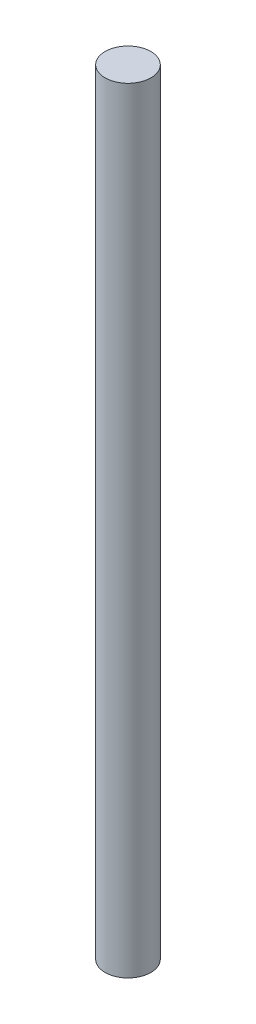
ISO-10303-21;
HEADER;
FILE_DESCRIPTION(('STEP AP214'),'2;1');
FILE_NAME('part.step','',(''),(''),'','','');
FILE_SCHEMA(('AUTOMOTIVE_DESIGN { 1 0 10303 214 1 1 1 1 }'));
ENDSEC;
DATA;
#1=APPLICATION_CONTEXT('core data for automotive mechanical design processes');
#2=APPLICATION_PROTOCOL_DEFINITION('international standard','automotive_design',2000,#1);
#3=PRODUCT_CONTEXT('',#1,'mechanical');
#4=PRODUCT('Part','Part','',(#3));
#5=PRODUCT_RELATED_PRODUCT_CATEGORY('part','',(#4));
#6=PRODUCT_DEFINITION_FORMATION('','',#4);
#7=PRODUCT_DEFINITION_CONTEXT('part definition',#1,'design');
#8=PRODUCT_DEFINITION('design','',#6,#7);
#9=PRODUCT_DEFINITION_SHAPE('','',#8);
#10=(LENGTH_UNIT() NAMED_UNIT(*) SI_UNIT(.MILLI.,.METRE.));
#11=(NAMED_UNIT(*) PLANE_ANGLE_UNIT() SI_UNIT($,.RADIAN.));
#12=(NAMED_UNIT(*) SI_UNIT($,.STERADIAN.) SOLID_ANGLE_UNIT());
#13=UNCERTAINTY_MEASURE_WITH_UNIT(LENGTH_MEASURE(1.E-05),#10,'distance_accuracy_value','');
#14=(GEOMETRIC_REPRESENTATION_CONTEXT(3) GLOBAL_UNCERTAINTY_ASSIGNED_CONTEXT((#13)) GLOBAL_UNIT_ASSIGNED_CONTEXT((#10,
#11,#12)) REPRESENTATION_CONTEXT('',''));
#15=CARTESIAN_POINT('',(0.,0.,0.));
#16=DIRECTION('',(0.,0.,1.));
#17=DIRECTION('',(1.,0.,0.));
#18=AXIS2_PLACEMENT_3D('',#15,#16,#17);
#19=CARTESIAN_POINT('',(0.,500.,0.));
#20=DIRECTION('',(0.,-1.,0.));
#21=DIRECTION('',(0.,0.,-1.));
#22=AXIS2_PLACEMENT_3D('',#19,#20,#21);
#23=CYLINDRICAL_SURFACE('',#22,14.75);
#24=CARTESIAN_POINT('',(0.,500.,0.));
#25=DIRECTION('',(0.,1.,0.));
#26=DIRECTION('',(0.,0.,1.));
#27=AXIS2_PLACEMENT_3D('',#24,#25,#26);
#28=CIRCLE('',#27,14.75);
#29=CARTESIAN_POINT('',(0.,500.,14.75));
#30=VERTEX_POINT('',#29);
#31=EDGE_CURVE('E10',#30,#30,#28,.T.);
#32=ORIENTED_EDGE('',*,*,#31,.F.);
#33=EDGE_LOOP('',(#32));
#34=FACE_BOUND('',#33,.T.);
#35=CARTESIAN_POINT('',(0.,0.,0.));
#36=DIRECTION('',(0.,1.,0.));
#37=DIRECTION('',(0.,0.,1.));
#38=AXIS2_PLACEMENT_3D('',#35,#36,#37);
#39=CIRCLE('',#38,14.75);
#40=CARTESIAN_POINT('',(0.,0.,14.75));
#41=VERTEX_POINT('',#40);
#42=EDGE_CURVE('E36',#41,#41,#39,.T.);
#43=ORIENTED_EDGE('',*,*,#42,.T.);
#44=EDGE_LOOP('',(#43));
#45=FACE_BOUND('',#44,.T.);
#46=ADVANCED_FACE('F33',(#34,#45),#23,.T.);
#47=CARTESIAN_POINT('',(0.,500.,0.));
#48=DIRECTION('',(0.,1.,0.));
#49=DIRECTION('',(0.,0.,1.));
#50=AXIS2_PLACEMENT_3D('',#47,#48,#49);
#51=PLANE('',#50);
#52=ORIENTED_EDGE('',*,*,#31,.T.);
#53=EDGE_LOOP('',(#52));
#54=FACE_BOUND('',#53,.T.);
#55=ADVANCED_FACE('F48',(#54),#51,.T.);
#56=CARTESIAN_POINT('',(0.,0.,0.));
#57=DIRECTION('',(0.,1.,0.));
#58=DIRECTION('',(0.,0.,1.));
#59=AXIS2_PLACEMENT_3D('',#56,#57,#58);
#60=PLANE('',#59);
#61=ORIENTED_EDGE('',*,*,#42,.F.);
#62=EDGE_LOOP('',(#61));
#63=FACE_BOUND('',#62,.T.);
#64=ADVANCED_FACE('F46',(#63),#60,.F.);
#65=CLOSED_SHELL('',(#46,#55,#64));
#66=MANIFOLD_SOLID_BREP('B2',#65);
#67=ADVANCED_BREP_SHAPE_REPRESENTATION('',(#18,#66),#14);
#68=SHAPE_DEFINITION_REPRESENTATION(#9,#67);
ENDSEC;
END-ISO-10303-21;
